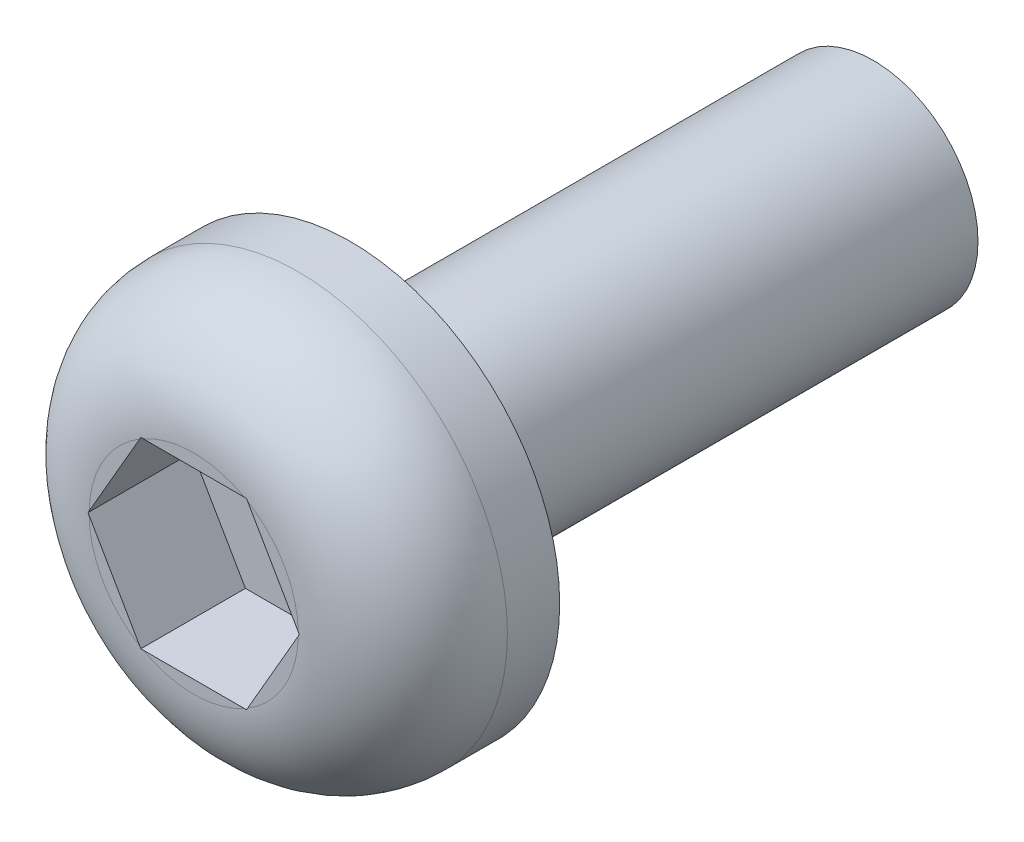
ISO-10303-21;
HEADER;
FILE_DESCRIPTION(('STEP AP214'),'2;1');
FILE_NAME('part.step','',(''),(''),'','','');
FILE_SCHEMA(('AUTOMOTIVE_DESIGN { 1 0 10303 214 1 1 1 1 }'));
ENDSEC;
DATA;
#1=APPLICATION_CONTEXT('core data for automotive mechanical design processes');
#2=APPLICATION_PROTOCOL_DEFINITION('international standard','automotive_design',2000,#1);
#3=PRODUCT_CONTEXT('',#1,'mechanical');
#4=PRODUCT('Part','Part','',(#3));
#5=PRODUCT_RELATED_PRODUCT_CATEGORY('part','',(#4));
#6=PRODUCT_DEFINITION_FORMATION('','',#4);
#7=PRODUCT_DEFINITION_CONTEXT('part definition',#1,'design');
#8=PRODUCT_DEFINITION('design','',#6,#7);
#9=PRODUCT_DEFINITION_SHAPE('','',#8);
#10=(LENGTH_UNIT() NAMED_UNIT(*) SI_UNIT(.MILLI.,.METRE.));
#11=(NAMED_UNIT(*) PLANE_ANGLE_UNIT() SI_UNIT($,.RADIAN.));
#12=(NAMED_UNIT(*) SI_UNIT($,.STERADIAN.) SOLID_ANGLE_UNIT());
#13=UNCERTAINTY_MEASURE_WITH_UNIT(LENGTH_MEASURE(1.E-05),#10,'distance_accuracy_value','');
#14=(GEOMETRIC_REPRESENTATION_CONTEXT(3) GLOBAL_UNCERTAINTY_ASSIGNED_CONTEXT((#13)) GLOBAL_UNIT_ASSIGNED_CONTEXT((#10,
#11,#12)) REPRESENTATION_CONTEXT('',''));
#15=CARTESIAN_POINT('',(0.,0.,0.));
#16=DIRECTION('',(0.,0.,1.));
#17=DIRECTION('',(1.,0.,0.));
#18=AXIS2_PLACEMENT_3D('',#15,#16,#17);
#19=CARTESIAN_POINT('',(0.,0.,13.));
#20=DIRECTION('',(0.,0.,1.));
#21=DIRECTION('',(1.,0.,0.));
#22=AXIS2_PLACEMENT_3D('',#19,#20,#21);
#23=PLANE('',#22);
#24=DIRECTION('',(0.5,-0.866025403784439,0.));
#25=VECTOR('',#24,1.);
#26=CARTESIAN_POINT('',(-2.02072594216369,0.,13.));
#27=LINE('',#26,#25);
#28=CARTESIAN_POINT('',(-1.99966737489869,-0.0364745084375793,13.));
#29=VERTEX_POINT('',#28);
#30=CARTESIAN_POINT('',(-1.03142153834684,-1.71352549156242,13.));
#31=VERTEX_POINT('',#30);
#32=EDGE_CURVE('E164',#29,#31,#27,.T.);
#33=ORIENTED_EDGE('',*,*,#32,.F.);
#34=CARTESIAN_POINT('',(0.,0.,13.));
#35=DIRECTION('',(0.,0.,1.));
#36=DIRECTION('',(1.,0.,0.));
#37=AXIS2_PLACEMENT_3D('',#34,#35,#36);
#38=CIRCLE('',#37,2.);
#39=EDGE_CURVE('E237',#29,#31,#38,.T.);
#40=ORIENTED_EDGE('',*,*,#39,.T.);
#41=EDGE_LOOP('',(#33,#40));
#42=FACE_BOUND('',#41,.T.);
#43=ADVANCED_FACE('F39',(#42),#23,.T.);
#44=DIRECTION('',(1.,0.,0.));
#45=VECTOR('',#44,1.);
#46=CARTESIAN_POINT('',(-1.01036297108185,-1.75,13.));
#47=LINE('',#46,#45);
#48=CARTESIAN_POINT('',(-0.968245836551859,-1.75,13.));
#49=VERTEX_POINT('',#48);
#50=CARTESIAN_POINT('',(0.968245836551858,-1.75,13.));
#51=VERTEX_POINT('',#50);
#52=EDGE_CURVE('E160',#49,#51,#47,.T.);
#53=ORIENTED_EDGE('',*,*,#52,.F.);
#54=CARTESIAN_POINT('',(0.,0.,13.));
#55=DIRECTION('',(0.,0.,1.));
#56=DIRECTION('',(1.,0.,0.));
#57=AXIS2_PLACEMENT_3D('',#54,#55,#56);
#58=CIRCLE('',#57,2.);
#59=EDGE_CURVE('E234',#49,#51,#58,.T.);
#60=ORIENTED_EDGE('',*,*,#59,.T.);
#61=EDGE_LOOP('',(#53,#60));
#62=FACE_BOUND('',#61,.T.);
#63=ADVANCED_FACE('F367',(#62),#23,.T.);
#64=DIRECTION('',(0.5,0.866025403784439,0.));
#65=VECTOR('',#64,1.);
#66=CARTESIAN_POINT('',(1.01036297108184,-1.75,13.));
#67=LINE('',#66,#65);
#68=CARTESIAN_POINT('',(1.03142153834684,-1.71352549156242,13.));
#69=VERTEX_POINT('',#68);
#70=CARTESIAN_POINT('',(1.99966737489869,-0.0364745084375732,13.));
#71=VERTEX_POINT('',#70);
#72=EDGE_CURVE('E178',#69,#71,#67,.T.);
#73=ORIENTED_EDGE('',*,*,#72,.F.);
#74=CARTESIAN_POINT('',(0.,0.,13.));
#75=DIRECTION('',(0.,0.,1.));
#76=DIRECTION('',(1.,0.,0.));
#77=AXIS2_PLACEMENT_3D('',#74,#75,#76);
#78=CIRCLE('',#77,2.);
#79=EDGE_CURVE('E231',#69,#71,#78,.T.);
#80=ORIENTED_EDGE('',*,*,#79,.T.);
#81=EDGE_LOOP('',(#73,#80));
#82=FACE_BOUND('',#81,.T.);
#83=ADVANCED_FACE('F369',(#82),#23,.T.);
#84=DIRECTION('',(-0.5,0.866025403784439,0.));
#85=VECTOR('',#84,1.);
#86=CARTESIAN_POINT('',(2.02072594216369,0.,13.));
#87=LINE('',#86,#85);
#88=CARTESIAN_POINT('',(1.99966737489869,0.0364745084375782,13.));
#89=VERTEX_POINT('',#88);
#90=CARTESIAN_POINT('',(1.03142153834684,1.71352549156242,13.));
#91=VERTEX_POINT('',#90);
#92=EDGE_CURVE('E181',#89,#91,#87,.T.);
#93=ORIENTED_EDGE('',*,*,#92,.F.);
#94=CARTESIAN_POINT('',(0.,0.,13.));
#95=DIRECTION('',(0.,0.,1.));
#96=DIRECTION('',(1.,0.,0.));
#97=AXIS2_PLACEMENT_3D('',#94,#95,#96);
#98=CIRCLE('',#97,2.);
#99=EDGE_CURVE('E228',#89,#91,#98,.T.);
#100=ORIENTED_EDGE('',*,*,#99,.T.);
#101=EDGE_LOOP('',(#93,#100));
#102=FACE_BOUND('',#101,.T.);
#103=ADVANCED_FACE('F374',(#102),#23,.T.);
#104=DIRECTION('',(-1.,0.,0.));
#105=VECTOR('',#104,1.);
#106=CARTESIAN_POINT('',(1.01036297108184,1.75,13.));
#107=LINE('',#106,#105);
#108=CARTESIAN_POINT('',(0.968245836551848,1.75,13.));
#109=VERTEX_POINT('',#108);
#110=CARTESIAN_POINT('',(-0.968245836551848,1.75,13.));
#111=VERTEX_POINT('',#110);
#112=EDGE_CURVE('E184',#109,#111,#107,.T.);
#113=ORIENTED_EDGE('',*,*,#112,.F.);
#114=CARTESIAN_POINT('',(0.,0.,13.));
#115=DIRECTION('',(0.,0.,1.));
#116=DIRECTION('',(1.,0.,0.));
#117=AXIS2_PLACEMENT_3D('',#114,#115,#116);
#118=CIRCLE('',#117,2.);
#119=EDGE_CURVE('E225',#109,#111,#118,.T.);
#120=ORIENTED_EDGE('',*,*,#119,.T.);
#121=EDGE_LOOP('',(#113,#120));
#122=FACE_BOUND('',#121,.T.);
#123=ADVANCED_FACE('F382',(#122),#23,.T.);
#124=CARTESIAN_POINT('',(0.,0.,10.));
#125=DIRECTION('',(0.,0.,-1.));
#126=DIRECTION('',(-1.,0.,0.));
#127=AXIS2_PLACEMENT_3D('',#124,#125,#126);
#128=CYLINDRICAL_SURFACE('',#127,2.);
#129=CARTESIAN_POINT('',(0.,0.,10.));
#130=DIRECTION('',(0.,0.,1.));
#131=DIRECTION('',(1.,0.,0.));
#132=AXIS2_PLACEMENT_3D('',#129,#130,#131);
#133=CIRCLE('',#132,2.);
#134=CARTESIAN_POINT('',(2.,0.,10.));
#135=VERTEX_POINT('',#134);
#136=EDGE_CURVE('E215',#135,#135,#133,.T.);
#137=ORIENTED_EDGE('',*,*,#136,.F.);
#138=EDGE_LOOP('',(#137));
#139=FACE_BOUND('',#138,.T.);
#140=CARTESIAN_POINT('',(0.,0.,0.));
#141=DIRECTION('',(0.,0.,1.));
#142=DIRECTION('',(1.,0.,0.));
#143=AXIS2_PLACEMENT_3D('',#140,#141,#142);
#144=CIRCLE('',#143,2.);
#145=CARTESIAN_POINT('',(2.,0.,0.));
#146=VERTEX_POINT('',#145);
#147=EDGE_CURVE('E214',#146,#146,#144,.T.);
#148=ORIENTED_EDGE('',*,*,#147,.T.);
#149=EDGE_LOOP('',(#148));
#150=FACE_BOUND('',#149,.T.);
#151=ADVANCED_FACE('F392',(#139,#150),#128,.T.);
#152=CARTESIAN_POINT('',(0.,0.,0.));
#153=DIRECTION('',(0.,0.,1.));
#154=DIRECTION('',(1.,0.,0.));
#155=AXIS2_PLACEMENT_3D('',#152,#153,#154);
#156=PLANE('',#155);
#157=ORIENTED_EDGE('',*,*,#147,.F.);
#158=EDGE_LOOP('',(#157));
#159=FACE_BOUND('',#158,.T.);
#160=ADVANCED_FACE('F388',(#159),#156,.F.);
#161=CARTESIAN_POINT('',(0.,0.,13.));
#162=DIRECTION('',(0.,0.,-1.));
#163=DIRECTION('',(-1.,0.,0.));
#164=AXIS2_PLACEMENT_3D('',#161,#162,#163);
#165=CYLINDRICAL_SURFACE('',#164,4.);
#166=CARTESIAN_POINT('',(0.,0.,11.));
#167=DIRECTION('',(0.,0.,1.));
#168=DIRECTION('',(1.,0.,0.));
#169=AXIS2_PLACEMENT_3D('',#166,#167,#168);
#170=CIRCLE('',#169,4.);
#171=CARTESIAN_POINT('',(4.,0.,11.));
#172=VERTEX_POINT('',#171);
#173=EDGE_CURVE('E11',#172,#172,#170,.F.);
#174=ORIENTED_EDGE('',*,*,#173,.T.);
#175=EDGE_LOOP('',(#174));
#176=FACE_BOUND('',#175,.T.);
#177=CARTESIAN_POINT('',(0.,0.,10.));
#178=DIRECTION('',(0.,0.,1.));
#179=DIRECTION('',(1.,0.,0.));
#180=AXIS2_PLACEMENT_3D('',#177,#178,#179);
#181=CIRCLE('',#180,4.);
#182=CARTESIAN_POINT('',(4.,0.,10.));
#183=VERTEX_POINT('',#182);
#184=EDGE_CURVE('E197',#183,#183,#181,.T.);
#185=ORIENTED_EDGE('',*,*,#184,.T.);
#186=EDGE_LOOP('',(#185));
#187=FACE_BOUND('',#186,.T.);
#188=ADVANCED_FACE('F380',(#176,#187),#165,.T.);
#189=DIRECTION('',(-0.5,-0.866025403784439,0.));
#190=VECTOR('',#189,1.);
#191=CARTESIAN_POINT('',(-1.01036297108185,1.75,13.));
#192=LINE('',#191,#190);
#193=CARTESIAN_POINT('',(-1.03142153834685,1.71352549156242,13.));
#194=VERTEX_POINT('',#193);
#195=CARTESIAN_POINT('',(-1.99966737489869,0.0364745084375842,13.));
#196=VERTEX_POINT('',#195);
#197=EDGE_CURVE('E187',#194,#196,#192,.T.);
#198=ORIENTED_EDGE('',*,*,#197,.F.);
#199=CARTESIAN_POINT('',(0.,0.,13.));
#200=DIRECTION('',(0.,0.,1.));
#201=DIRECTION('',(1.,0.,0.));
#202=AXIS2_PLACEMENT_3D('',#199,#200,#201);
#203=CIRCLE('',#202,2.);
#204=EDGE_CURVE('E219',#194,#196,#203,.T.);
#205=ORIENTED_EDGE('',*,*,#204,.T.);
#206=EDGE_LOOP('',(#198,#205));
#207=FACE_BOUND('',#206,.T.);
#208=ADVANCED_FACE('F325',(#207),#23,.T.);
#209=CARTESIAN_POINT('',(0.,0.,10.));
#210=DIRECTION('',(0.,0.,1.));
#211=DIRECTION('',(1.,0.,0.));
#212=AXIS2_PLACEMENT_3D('',#209,#210,#211);
#213=PLANE('',#212);
#214=ORIENTED_EDGE('',*,*,#136,.T.);
#215=EDGE_LOOP('',(#214));
#216=FACE_BOUND('',#215,.T.);
#217=ORIENTED_EDGE('',*,*,#184,.F.);
#218=EDGE_LOOP('',(#217));
#219=FACE_BOUND('',#218,.T.);
#220=ADVANCED_FACE('F324',(#216,#219),#213,.F.);
#221=CARTESIAN_POINT('',(1.01036297108184,-1.75,11.));
#222=DIRECTION('',(0.866025403784439,-0.5,0.));
#223=DIRECTION('',(0.5,0.866025403784439,0.));
#224=AXIS2_PLACEMENT_3D('',#221,#222,#223);
#225=PLANE('',#224);
#226=DIRECTION('',(0.,0.,1.));
#227=VECTOR('',#226,1.);
#228=CARTESIAN_POINT('',(1.01036297108184,-1.75,11.));
#229=LINE('',#228,#227);
#230=CARTESIAN_POINT('',(1.01036297108184,-1.75,11.));
#231=VERTEX_POINT('',#230);
#232=CARTESIAN_POINT('',(1.01036297108184,-1.75,12.999892605947));
#233=VERTEX_POINT('',#232);
#234=EDGE_CURVE('E194',#231,#233,#229,.T.);
#235=ORIENTED_EDGE('',*,*,#234,.T.);
#236=CARTESIAN_POINT('',(1.01036297108184,-1.75,12.999892605947));
#237=CARTESIAN_POINT('',(1.01387270919851,-1.74392095526068,12.9999286917835));
#238=CARTESIAN_POINT('',(1.01738245890877,-1.73784189044065,12.9999556842062));
#239=CARTESIAN_POINT('',(1.02440198133044,-1.72568372096145,12.9999914822229));
#240=CARTESIAN_POINT('',(1.02791175404184,-1.71960461630229,13.0000002878179));
#241=CARTESIAN_POINT('',(1.03142153834684,-1.71352549156242,13.));
#242=B_SPLINE_CURVE_WITH_KNOTS('',3,(#236,#237,#238,#239,#240,#241),.UNSPECIFIED.,.F.,.F.,(4,2,
4),(0.,0.0210586539539293,0.0421173067914473),.UNSPECIFIED.);
#243=EDGE_CURVE('E334',#233,#69,#242,.T.);
#244=ORIENTED_EDGE('',*,*,#243,.T.);
#245=ORIENTED_EDGE('',*,*,#72,.T.);
#246=CARTESIAN_POINT('',(1.99966737489869,-0.0364745084375733,13.));
#247=CARTESIAN_POINT('',(2.00317715920369,-0.0303953836977059,13.0000002878179));
#248=CARTESIAN_POINT('',(2.00668693191509,-0.0243162790385434,12.9999914822229));
#249=CARTESIAN_POINT('',(2.01370645433676,-0.0121581095593493,12.9999556842062));
#250=CARTESIAN_POINT('',(2.01721620404702,-0.00607904473931982,12.9999286917835));
#251=CARTESIAN_POINT('',(2.02072594216369,0.,12.999892605947));
#252=B_SPLINE_CURVE_WITH_KNOTS('',3,(#246,#247,#248,#249,#250,#251),.UNSPECIFIED.,.F.,.F.,(4,2,
4),(0.,0.021058652837519,0.042117306791449),.UNSPECIFIED.);
#253=CARTESIAN_POINT('',(2.02072594216369,0.,12.999892605947));
#254=VERTEX_POINT('',#253);
#255=EDGE_CURVE('E141',#71,#254,#252,.T.);
#256=ORIENTED_EDGE('',*,*,#255,.T.);
#257=DIRECTION('',(0.,0.,1.));
#258=VECTOR('',#257,1.);
#259=CARTESIAN_POINT('',(2.02072594216369,0.,11.));
#260=LINE('',#259,#258);
#261=CARTESIAN_POINT('',(2.02072594216369,0.,11.));
#262=VERTEX_POINT('',#261);
#263=EDGE_CURVE('E132',#262,#254,#260,.T.);
#264=ORIENTED_EDGE('',*,*,#263,.F.);
#265=DIRECTION('',(0.5,0.866025403784439,0.));
#266=VECTOR('',#265,1.);
#267=CARTESIAN_POINT('',(1.01036297108184,-1.75,11.));
#268=LINE('',#267,#266);
#269=EDGE_CURVE('E137',#231,#262,#268,.T.);
#270=ORIENTED_EDGE('',*,*,#269,.F.);
#271=EDGE_LOOP('',(#235,#244,#245,#256,#264,#270));
#272=FACE_BOUND('',#271,.T.);
#273=ADVANCED_FACE('F135',(#272),#225,.F.);
#274=CARTESIAN_POINT('',(-1.01036297108185,-1.75,11.));
#275=DIRECTION('',(0.,-1.,0.));
#276=DIRECTION('',(1.,0.,0.));
#277=AXIS2_PLACEMENT_3D('',#274,#275,#276);
#278=PLANE('',#277);
#279=DIRECTION('',(0.,0.,1.));
#280=VECTOR('',#279,1.);
#281=CARTESIAN_POINT('',(-1.01036297108185,-1.75,11.));
#282=LINE('',#281,#280);
#283=CARTESIAN_POINT('',(-1.01036297108185,-1.75,11.));
#284=VERTEX_POINT('',#283);
#285=CARTESIAN_POINT('',(-1.01036297108185,-1.75,12.999892605947));
#286=VERTEX_POINT('',#285);
#287=EDGE_CURVE('E198',#284,#286,#282,.T.);
#288=ORIENTED_EDGE('',*,*,#287,.T.);
#289=CARTESIAN_POINT('',(-1.01036297108185,-1.75,12.999892605947));
#290=CARTESIAN_POINT('',(-1.00334349484852,-1.75,12.9999286917835));
#291=CARTESIAN_POINT('',(-0.996323995427989,-1.75,12.9999556842062));
#292=CARTESIAN_POINT('',(-0.982284950584657,-1.75,12.9999914822229));
#293=CARTESIAN_POINT('',(-0.975265405161858,-1.75,13.0000002878179));
#294=CARTESIAN_POINT('',(-0.968245836551859,-1.75,13.));
#295=B_SPLINE_CURVE_WITH_KNOTS('',3,(#289,#290,#291,#292,#293,#294),.UNSPECIFIED.,.F.,.F.,(4,2,
4),(0.,0.0210586539539306,0.0421173067914502),.UNSPECIFIED.);
#296=EDGE_CURVE('E344',#286,#49,#295,.T.);
#297=ORIENTED_EDGE('',*,*,#296,.T.);
#298=ORIENTED_EDGE('',*,*,#52,.T.);
#299=CARTESIAN_POINT('',(0.968245836551858,-1.75,13.));
#300=CARTESIAN_POINT('',(0.975265405161857,-1.75,13.0000002878179));
#301=CARTESIAN_POINT('',(0.982284950584656,-1.75,12.9999914822229));
#302=CARTESIAN_POINT('',(0.996323995427987,-1.75,12.9999556842062));
#303=CARTESIAN_POINT('',(1.00334349484852,-1.75,12.9999286917835));
#304=CARTESIAN_POINT('',(1.01036297108184,-1.75,12.999892605947));
#305=B_SPLINE_CURVE_WITH_KNOTS('',3,(#299,#300,#301,#302,#303,#304),.UNSPECIFIED.,.F.,.F.,(4,2,
4),(0.,0.0210586528375183,0.0421173067914476),.UNSPECIFIED.);
#306=EDGE_CURVE('E346',#51,#233,#305,.T.);
#307=ORIENTED_EDGE('',*,*,#306,.T.);
#308=ORIENTED_EDGE('',*,*,#234,.F.);
#309=DIRECTION('',(1.,0.,0.));
#310=VECTOR('',#309,1.);
#311=CARTESIAN_POINT('',(-1.01036297108185,-1.75,11.));
#312=LINE('',#311,#310);
#313=EDGE_CURVE('E145',#284,#231,#312,.T.);
#314=ORIENTED_EDGE('',*,*,#313,.F.);
#315=EDGE_LOOP('',(#288,#297,#298,#307,#308,#314));
#316=FACE_BOUND('',#315,.T.);
#317=ADVANCED_FACE('F261',(#316),#278,.F.);
#318=CARTESIAN_POINT('',(-2.02072594216369,0.,11.));
#319=DIRECTION('',(-0.866025403784439,-0.5,0.));
#320=DIRECTION('',(0.5,-0.866025403784439,0.));
#321=AXIS2_PLACEMENT_3D('',#318,#319,#320);
#322=PLANE('',#321);
#323=ORIENTED_EDGE('',*,*,#32,.T.);
#324=CARTESIAN_POINT('',(-1.03142153834684,-1.71352549156242,13.));
#325=CARTESIAN_POINT('',(-1.02791175404184,-1.71960461630229,13.0000002878179));
#326=CARTESIAN_POINT('',(-1.02440198133044,-1.72568372096145,12.9999914822229));
#327=CARTESIAN_POINT('',(-1.01738245890878,-1.73784189044065,12.9999556842062));
#328=CARTESIAN_POINT('',(-1.01387270919851,-1.74392095526067,12.9999286917835));
#329=CARTESIAN_POINT('',(-1.01036297108185,-1.75,12.999892605947));
#330=B_SPLINE_CURVE_WITH_KNOTS('',3,(#324,#325,#326,#327,#328,#329),.UNSPECIFIED.,.F.,.F.,(4,2,
4),(0.,0.0210586528375193,0.0421173067914498),.UNSPECIFIED.);
#331=EDGE_CURVE('E249',#31,#286,#330,.T.);
#332=ORIENTED_EDGE('',*,*,#331,.T.);
#333=ORIENTED_EDGE('',*,*,#287,.F.);
#334=DIRECTION('',(0.5,-0.866025403784439,0.));
#335=VECTOR('',#334,1.);
#336=CARTESIAN_POINT('',(-2.02072594216369,0.,11.));
#337=LINE('',#336,#335);
#338=CARTESIAN_POINT('',(-2.02072594216369,0.,11.));
#339=VERTEX_POINT('',#338);
#340=EDGE_CURVE('E173',#339,#284,#337,.T.);
#341=ORIENTED_EDGE('',*,*,#340,.F.);
#342=DIRECTION('',(0.,0.,1.));
#343=VECTOR('',#342,1.);
#344=CARTESIAN_POINT('',(-2.02072594216369,0.,11.));
#345=LINE('',#344,#343);
#346=CARTESIAN_POINT('',(-2.02072594216369,0.,12.999892605947));
#347=VERTEX_POINT('',#346);
#348=EDGE_CURVE('E202',#339,#347,#345,.T.);
#349=ORIENTED_EDGE('',*,*,#348,.T.);
#350=CARTESIAN_POINT('',(-2.02072594216369,0.,12.999892605947));
#351=CARTESIAN_POINT('',(-2.01721620404703,-0.00607904473932128,12.9999286917835));
#352=CARTESIAN_POINT('',(-2.01370645433676,-0.0121581095593517,12.9999556842062));
#353=CARTESIAN_POINT('',(-2.0066869319151,-0.0243162790385477,12.9999914822229));
#354=CARTESIAN_POINT('',(-2.0031771592037,-0.0303953836977112,13.0000002878179));
#355=CARTESIAN_POINT('',(-1.99966737489869,-0.0364745084375795,13.));
#356=B_SPLINE_CURVE_WITH_KNOTS('',3,(#350,#351,#352,#353,#354,#355),.UNSPECIFIED.,.F.,.F.,(4,2,
4),(0.,0.0210586539539334,0.0421173067914557),.UNSPECIFIED.);
#357=EDGE_CURVE('E241',#347,#29,#356,.T.);
#358=ORIENTED_EDGE('',*,*,#357,.T.);
#359=EDGE_LOOP('',(#323,#332,#333,#341,#349,#358));
#360=FACE_BOUND('',#359,.T.);
#361=ADVANCED_FACE('F255',(#360),#322,.F.);
#362=CARTESIAN_POINT('',(-1.01036297108185,1.75,11.));
#363=DIRECTION('',(-0.866025403784439,0.5,0.));
#364=DIRECTION('',(-0.5,-0.866025403784439,0.));
#365=AXIS2_PLACEMENT_3D('',#362,#363,#364);
#366=PLANE('',#365);
#367=DIRECTION('',(0.,0.,1.));
#368=VECTOR('',#367,1.);
#369=CARTESIAN_POINT('',(-1.01036297108185,1.75,11.));
#370=LINE('',#369,#368);
#371=CARTESIAN_POINT('',(-1.01036297108185,1.75,11.));
#372=VERTEX_POINT('',#371);
#373=CARTESIAN_POINT('',(-1.01036297108185,1.75,12.999892605947));
#374=VERTEX_POINT('',#373);
#375=EDGE_CURVE('E206',#372,#374,#370,.T.);
#376=ORIENTED_EDGE('',*,*,#375,.T.);
#377=CARTESIAN_POINT('',(-1.01036297108185,1.75,12.999892605947));
#378=CARTESIAN_POINT('',(-1.01387270919851,1.74392095526068,12.9999286917835));
#379=CARTESIAN_POINT('',(-1.01738245890878,1.73784189044065,12.9999556842062));
#380=CARTESIAN_POINT('',(-1.02440198133044,1.72568372096145,12.9999914822229));
#381=CARTESIAN_POINT('',(-1.02791175404184,1.71960461630229,13.0000002878179));
#382=CARTESIAN_POINT('',(-1.03142153834685,1.71352549156242,13.));
#383=B_SPLINE_CURVE_WITH_KNOTS('',3,(#377,#378,#379,#380,#381,#382),.UNSPECIFIED.,.F.,.F.,(4,2,
4),(0.,0.0210586539539358,0.0421173067914604),.UNSPECIFIED.);
#384=EDGE_CURVE('E49',#374,#194,#383,.T.);
#385=ORIENTED_EDGE('',*,*,#384,.T.);
#386=ORIENTED_EDGE('',*,*,#197,.T.);
#387=CARTESIAN_POINT('',(-1.99966737489869,0.0364745084375846,13.));
#388=CARTESIAN_POINT('',(-2.00317715920369,0.030395383697716,13.0000002878179));
#389=CARTESIAN_POINT('',(-2.00668693191509,0.0243162790385524,12.9999914822229));
#390=CARTESIAN_POINT('',(-2.01370645433676,0.0121581095593561,12.9999556842062));
#391=CARTESIAN_POINT('',(-2.01721620404703,0.00607904473932555,12.9999286917835));
#392=CARTESIAN_POINT('',(-2.02072594216369,0.,12.999892605947));
#393=B_SPLINE_CURVE_WITH_KNOTS('',3,(#387,#388,#389,#390,#391,#392),.UNSPECIFIED.,.F.,.F.,(4,2,
4),(0.,0.0210586528375226,0.0421173067914564),.UNSPECIFIED.);
#394=EDGE_CURVE('E275',#196,#347,#393,.T.);
#395=ORIENTED_EDGE('',*,*,#394,.T.);
#396=ORIENTED_EDGE('',*,*,#348,.F.);
#397=DIRECTION('',(-0.5,-0.866025403784439,0.));
#398=VECTOR('',#397,1.);
#399=CARTESIAN_POINT('',(-1.01036297108185,1.75,11.));
#400=LINE('',#399,#398);
#401=EDGE_CURVE('E169',#372,#339,#400,.T.);
#402=ORIENTED_EDGE('',*,*,#401,.F.);
#403=EDGE_LOOP('',(#376,#385,#386,#395,#396,#402));
#404=FACE_BOUND('',#403,.T.);
#405=ADVANCED_FACE('F260',(#404),#366,.F.);
#406=CARTESIAN_POINT('',(1.01036297108184,1.75,11.));
#407=DIRECTION('',(0.,1.,0.));
#408=DIRECTION('',(0.,0.,1.));
#409=AXIS2_PLACEMENT_3D('',#406,#407,#408);
#410=PLANE('',#409);
#411=DIRECTION('',(0.,0.,1.));
#412=VECTOR('',#411,1.);
#413=CARTESIAN_POINT('',(1.01036297108184,1.75,11.));
#414=LINE('',#413,#412);
#415=CARTESIAN_POINT('',(1.01036297108184,1.75,11.));
#416=VERTEX_POINT('',#415);
#417=CARTESIAN_POINT('',(1.01036297108184,1.75,12.999892605947));
#418=VERTEX_POINT('',#417);
#419=EDGE_CURVE('E144',#416,#418,#414,.T.);
#420=ORIENTED_EDGE('',*,*,#419,.T.);
#421=CARTESIAN_POINT('',(1.01036297108184,1.75,12.999892605947));
#422=CARTESIAN_POINT('',(1.00334349484851,1.75,12.9999286917835));
#423=CARTESIAN_POINT('',(0.996323995427983,1.75,12.9999556842062));
#424=CARTESIAN_POINT('',(0.982284950584649,1.75,12.9999914822229));
#425=CARTESIAN_POINT('',(0.975265405161849,1.75,13.0000002878179));
#426=CARTESIAN_POINT('',(0.968245836551848,1.75,13.));
#427=B_SPLINE_CURVE_WITH_KNOTS('',3,(#421,#422,#423,#424,#425,#426),.UNSPECIFIED.,.F.,.F.,(4,2,
4),(0.,0.0210586539539337,0.0421173067914564),.UNSPECIFIED.);
#428=EDGE_CURVE('E289',#418,#109,#427,.T.);
#429=ORIENTED_EDGE('',*,*,#428,.T.);
#430=ORIENTED_EDGE('',*,*,#112,.T.);
#431=CARTESIAN_POINT('',(-0.968245836551848,1.75,13.));
#432=CARTESIAN_POINT('',(-0.975265405161849,1.75,13.0000002878179));
#433=CARTESIAN_POINT('',(-0.98228495058465,1.75,12.9999914822229));
#434=CARTESIAN_POINT('',(-0.996323995427985,1.75,12.9999556842062));
#435=CARTESIAN_POINT('',(-1.00334349484852,1.75,12.9999286917835));
#436=CARTESIAN_POINT('',(-1.01036297108185,1.75,12.999892605947));
#437=B_SPLINE_CURVE_WITH_KNOTS('',3,(#431,#432,#433,#434,#435,#436),.UNSPECIFIED.,.F.,.F.,(4,2,
4),(0.,0.0210586528375245,0.0421173067914601),.UNSPECIFIED.);
#438=EDGE_CURVE('E56',#111,#374,#437,.T.);
#439=ORIENTED_EDGE('',*,*,#438,.T.);
#440=ORIENTED_EDGE('',*,*,#375,.F.);
#441=DIRECTION('',(-1.,0.,0.));
#442=VECTOR('',#441,1.);
#443=CARTESIAN_POINT('',(1.01036297108184,1.75,11.));
#444=LINE('',#443,#442);
#445=EDGE_CURVE('E154',#416,#372,#444,.T.);
#446=ORIENTED_EDGE('',*,*,#445,.F.);
#447=EDGE_LOOP('',(#420,#429,#430,#439,#440,#446));
#448=FACE_BOUND('',#447,.T.);
#449=ADVANCED_FACE('F269',(#448),#410,.F.);
#450=CARTESIAN_POINT('',(2.02072594216369,0.,11.));
#451=DIRECTION('',(0.866025403784439,0.5,0.));
#452=DIRECTION('',(-0.5,0.866025403784439,0.));
#453=AXIS2_PLACEMENT_3D('',#450,#451,#452);
#454=PLANE('',#453);
#455=ORIENTED_EDGE('',*,*,#263,.T.);
#456=CARTESIAN_POINT('',(2.02072594216369,0.,12.999892605947));
#457=CARTESIAN_POINT('',(2.01721620404702,0.00607904473932515,12.9999286917835));
#458=CARTESIAN_POINT('',(2.01370645433676,0.0121581095593546,12.9999556842062));
#459=CARTESIAN_POINT('',(2.00668693191509,0.0243162790385486,12.9999914822229));
#460=CARTESIAN_POINT('',(2.00317715920369,0.0303953836977111,13.0000002878179));
#461=CARTESIAN_POINT('',(1.99966737489869,0.0364745084375784,13.));
#462=B_SPLINE_CURVE_WITH_KNOTS('',3,(#456,#457,#458,#459,#460,#461),.UNSPECIFIED.,.F.,.F.,(4,2,
4),(0.,0.0210586539539299,0.0421173067914488),.UNSPECIFIED.);
#463=EDGE_CURVE('E295',#254,#89,#462,.T.);
#464=ORIENTED_EDGE('',*,*,#463,.T.);
#465=ORIENTED_EDGE('',*,*,#92,.T.);
#466=CARTESIAN_POINT('',(1.03142153834684,1.71352549156242,13.));
#467=CARTESIAN_POINT('',(1.02791175404184,1.71960461630229,13.0000002878179));
#468=CARTESIAN_POINT('',(1.02440198133044,1.72568372096145,12.9999914822229));
#469=CARTESIAN_POINT('',(1.01738245890877,1.73784189044065,12.9999556842062));
#470=CARTESIAN_POINT('',(1.01387270919851,1.74392095526068,12.9999286917835));
#471=CARTESIAN_POINT('',(1.01036297108184,1.75,12.999892605947));
#472=B_SPLINE_CURVE_WITH_KNOTS('',3,(#466,#467,#468,#469,#470,#471),.UNSPECIFIED.,.F.,.F.,(4,2,
4),(0.,0.0210586528375224,0.0421173067914559),.UNSPECIFIED.);
#473=EDGE_CURVE('E64',#91,#418,#472,.T.);
#474=ORIENTED_EDGE('',*,*,#473,.T.);
#475=ORIENTED_EDGE('',*,*,#419,.F.);
#476=DIRECTION('',(-0.5,0.866025403784439,0.));
#477=VECTOR('',#476,1.);
#478=CARTESIAN_POINT('',(2.02072594216369,0.,11.));
#479=LINE('',#478,#477);
#480=EDGE_CURVE('E148',#262,#416,#479,.T.);
#481=ORIENTED_EDGE('',*,*,#480,.F.);
#482=EDGE_LOOP('',(#455,#464,#465,#474,#475,#481));
#483=FACE_BOUND('',#482,.T.);
#484=ADVANCED_FACE('F149',(#483),#454,.F.);
#485=CARTESIAN_POINT('',(0.,0.,11.));
#486=DIRECTION('',(0.,0.,1.));
#487=DIRECTION('',(1.,0.,0.));
#488=AXIS2_PLACEMENT_3D('',#485,#486,#487);
#489=PLANE('',#488);
#490=ORIENTED_EDGE('',*,*,#269,.T.);
#491=ORIENTED_EDGE('',*,*,#480,.T.);
#492=ORIENTED_EDGE('',*,*,#445,.T.);
#493=ORIENTED_EDGE('',*,*,#401,.T.);
#494=ORIENTED_EDGE('',*,*,#340,.T.);
#495=ORIENTED_EDGE('',*,*,#313,.T.);
#496=EDGE_LOOP('',(#490,#491,#492,#493,#494,#495));
#497=FACE_BOUND('',#496,.T.);
#498=ADVANCED_FACE('F156',(#497),#489,.T.);
#499=CARTESIAN_POINT('',(0.,0.,11.));
#500=DIRECTION('',(0.,0.,1.));
#501=DIRECTION('',(1.,0.,0.));
#502=AXIS2_PLACEMENT_3D('',#499,#500,#501);
#503=DEGENERATE_TOROIDAL_SURFACE('',#502,2.,2.,.T.);
#504=ORIENTED_EDGE('',*,*,#173,.F.);
#505=EDGE_LOOP('',(#504));
#506=FACE_BOUND('',#505,.T.);
#507=ORIENTED_EDGE('',*,*,#331,.F.);
#508=ORIENTED_EDGE('',*,*,#39,.F.);
#509=ORIENTED_EDGE('',*,*,#357,.F.);
#510=ORIENTED_EDGE('',*,*,#394,.F.);
#511=ORIENTED_EDGE('',*,*,#204,.F.);
#512=ORIENTED_EDGE('',*,*,#384,.F.);
#513=ORIENTED_EDGE('',*,*,#438,.F.);
#514=ORIENTED_EDGE('',*,*,#119,.F.);
#515=ORIENTED_EDGE('',*,*,#428,.F.);
#516=ORIENTED_EDGE('',*,*,#473,.F.);
#517=ORIENTED_EDGE('',*,*,#99,.F.);
#518=ORIENTED_EDGE('',*,*,#463,.F.);
#519=ORIENTED_EDGE('',*,*,#255,.F.);
#520=ORIENTED_EDGE('',*,*,#79,.F.);
#521=ORIENTED_EDGE('',*,*,#243,.F.);
#522=ORIENTED_EDGE('',*,*,#306,.F.);
#523=ORIENTED_EDGE('',*,*,#59,.F.);
#524=ORIENTED_EDGE('',*,*,#296,.F.);
#525=EDGE_LOOP('',(#507,#508,#509,#510,#511,#512,#513,#514,#515,#516,#517,#518,#519,#520,#521,
#522,#523,#524));
#526=FACE_BOUND('',#525,.T.);
#527=ADVANCED_FACE('F41',(#506,#526),#503,.T.);
#528=CLOSED_SHELL('',(#43,#63,#83,#103,#123,#151,#160,#188,#208,#220,#273,#317,#361,#405,#449,
#484,#498,#527));
#529=MANIFOLD_SOLID_BREP('B2',#528);
#530=ADVANCED_BREP_SHAPE_REPRESENTATION('',(#18,#529),#14);
#531=SHAPE_DEFINITION_REPRESENTATION(#9,#530);
ENDSEC;
END-ISO-10303-21;
